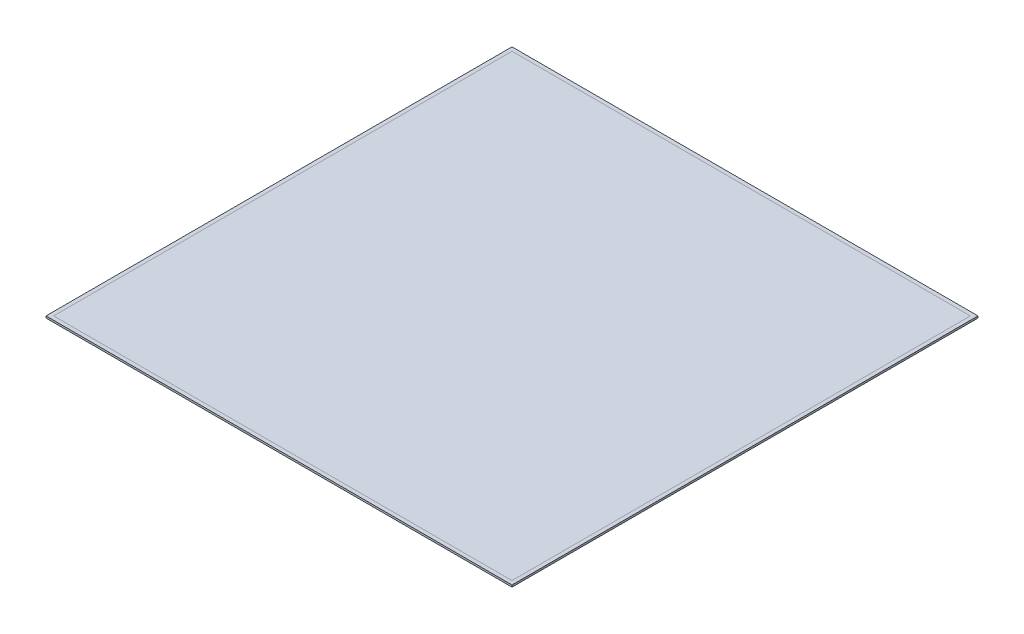
ISO-10303-21;
HEADER;
FILE_DESCRIPTION(('STEP AP214'),'2;1');
FILE_NAME('part.step','',(''),(''),'','','');
FILE_SCHEMA(('AUTOMOTIVE_DESIGN { 1 0 10303 214 1 1 1 1 }'));
ENDSEC;
DATA;
#1=APPLICATION_CONTEXT('core data for automotive mechanical design processes');
#2=APPLICATION_PROTOCOL_DEFINITION('international standard','automotive_design',2000,#1);
#3=PRODUCT_CONTEXT('',#1,'mechanical');
#4=PRODUCT('Part','Part','',(#3));
#5=PRODUCT_RELATED_PRODUCT_CATEGORY('part','',(#4));
#6=PRODUCT_DEFINITION_FORMATION('','',#4);
#7=PRODUCT_DEFINITION_CONTEXT('part definition',#1,'design');
#8=PRODUCT_DEFINITION('design','',#6,#7);
#9=PRODUCT_DEFINITION_SHAPE('','',#8);
#10=(LENGTH_UNIT() NAMED_UNIT(*) SI_UNIT(.MILLI.,.METRE.));
#11=(NAMED_UNIT(*) PLANE_ANGLE_UNIT() SI_UNIT($,.RADIAN.));
#12=(NAMED_UNIT(*) SI_UNIT($,.STERADIAN.) SOLID_ANGLE_UNIT());
#13=UNCERTAINTY_MEASURE_WITH_UNIT(LENGTH_MEASURE(1.E-05),#10,'distance_accuracy_value','');
#14=(GEOMETRIC_REPRESENTATION_CONTEXT(3) GLOBAL_UNCERTAINTY_ASSIGNED_CONTEXT((#13)) GLOBAL_UNIT_ASSIGNED_CONTEXT((#10,
#11,#12)) REPRESENTATION_CONTEXT('',''));
#15=CARTESIAN_POINT('',(0.,0.,0.));
#16=DIRECTION('',(0.,0.,1.));
#17=DIRECTION('',(1.,0.,0.));
#18=AXIS2_PLACEMENT_3D('',#15,#16,#17);
#19=CARTESIAN_POINT('',(0.,-0.1,0.));
#20=DIRECTION('',(0.,-1.,0.));
#21=DIRECTION('',(0.,0.,-1.));
#22=AXIS2_PLACEMENT_3D('',#19,#20,#21);
#23=PLANE('',#22);
#24=DIRECTION('',(0.,0.,1.));
#25=VECTOR('',#24,1.);
#26=CARTESIAN_POINT('',(420.,-0.1,420.));
#27=LINE('',#26,#25);
#28=CARTESIAN_POINT('',(420.,-0.1,-420.));
#29=VERTEX_POINT('',#28);
#30=CARTESIAN_POINT('',(420.,-0.1,420.));
#31=VERTEX_POINT('',#30);
#32=EDGE_CURVE('E144',#29,#31,#27,.T.);
#33=ORIENTED_EDGE('',*,*,#32,.T.);
#34=DIRECTION('',(-1.,0.,0.));
#35=VECTOR('',#34,1.);
#36=CARTESIAN_POINT('',(-420.,-0.1,420.));
#37=LINE('',#36,#35);
#38=CARTESIAN_POINT('',(-420.,-0.1,420.));
#39=VERTEX_POINT('',#38);
#40=EDGE_CURVE('E147',#31,#39,#37,.T.);
#41=ORIENTED_EDGE('',*,*,#40,.T.);
#42=DIRECTION('',(0.,0.,-1.));
#43=VECTOR('',#42,1.);
#44=CARTESIAN_POINT('',(-420.,-0.1,420.));
#45=LINE('',#44,#43);
#46=CARTESIAN_POINT('',(-420.,-0.1,-420.));
#47=VERTEX_POINT('',#46);
#48=EDGE_CURVE('E150',#39,#47,#45,.T.);
#49=ORIENTED_EDGE('',*,*,#48,.T.);
#50=DIRECTION('',(1.,0.,0.));
#51=VECTOR('',#50,1.);
#52=CARTESIAN_POINT('',(-420.,-0.1,-420.));
#53=LINE('',#52,#51);
#54=EDGE_CURVE('E152',#47,#29,#53,.T.);
#55=ORIENTED_EDGE('',*,*,#54,.T.);
#56=EDGE_LOOP('',(#33,#41,#49,#55));
#57=FACE_BOUND('',#56,.T.);
#58=DIRECTION('',(-1.,0.,0.));
#59=VECTOR('',#58,1.);
#60=CARTESIAN_POINT('',(-400.,-0.1,400.));
#61=LINE('',#60,#59);
#62=CARTESIAN_POINT('',(400.,-0.1,400.));
#63=VERTEX_POINT('',#62);
#64=CARTESIAN_POINT('',(-400.,-0.1,400.));
#65=VERTEX_POINT('',#64);
#66=EDGE_CURVE('E116',#63,#65,#61,.T.);
#67=ORIENTED_EDGE('',*,*,#66,.F.);
#68=DIRECTION('',(0.,0.,1.));
#69=VECTOR('',#68,1.);
#70=CARTESIAN_POINT('',(400.,-0.1,400.));
#71=LINE('',#70,#69);
#72=CARTESIAN_POINT('',(400.,-0.1,-400.));
#73=VERTEX_POINT('',#72);
#74=EDGE_CURVE('E108',#73,#63,#71,.T.);
#75=ORIENTED_EDGE('',*,*,#74,.F.);
#76=DIRECTION('',(1.,0.,0.));
#77=VECTOR('',#76,1.);
#78=CARTESIAN_POINT('',(-400.,-0.1,-400.));
#79=LINE('',#78,#77);
#80=CARTESIAN_POINT('',(-400.,-0.1,-400.));
#81=VERTEX_POINT('',#80);
#82=EDGE_CURVE('E130',#81,#73,#79,.T.);
#83=ORIENTED_EDGE('',*,*,#82,.F.);
#84=DIRECTION('',(0.,0.,-1.));
#85=VECTOR('',#84,1.);
#86=CARTESIAN_POINT('',(-400.,-0.1,400.));
#87=LINE('',#86,#85);
#88=EDGE_CURVE('E128',#65,#81,#87,.T.);
#89=ORIENTED_EDGE('',*,*,#88,.F.);
#90=EDGE_LOOP('',(#67,#75,#83,#89));
#91=FACE_BOUND('',#90,.T.);
#92=ADVANCED_FACE('F43',(#57,#91),#23,.T.);
#93=CARTESIAN_POINT('',(0.,0.,0.));
#94=DIRECTION('',(0.,-1.,0.));
#95=DIRECTION('',(0.,0.,-1.));
#96=AXIS2_PLACEMENT_3D('',#93,#94,#95);
#97=PLANE('',#96);
#98=DIRECTION('',(0.,0.,1.));
#99=VECTOR('',#98,1.);
#100=CARTESIAN_POINT('',(420.,0.,420.));
#101=LINE('',#100,#99);
#102=CARTESIAN_POINT('',(420.,0.,-420.));
#103=VERTEX_POINT('',#102);
#104=CARTESIAN_POINT('',(420.,0.,420.));
#105=VERTEX_POINT('',#104);
#106=EDGE_CURVE('E124',#103,#105,#101,.T.);
#107=ORIENTED_EDGE('',*,*,#106,.F.);
#108=DIRECTION('',(1.,0.,0.));
#109=VECTOR('',#108,1.);
#110=CARTESIAN_POINT('',(-420.,0.,-420.));
#111=LINE('',#110,#109);
#112=CARTESIAN_POINT('',(-420.,0.,-420.));
#113=VERTEX_POINT('',#112);
#114=EDGE_CURVE('E148',#113,#103,#111,.T.);
#115=ORIENTED_EDGE('',*,*,#114,.F.);
#116=DIRECTION('',(0.,0.,-1.));
#117=VECTOR('',#116,1.);
#118=CARTESIAN_POINT('',(-420.,0.,420.));
#119=LINE('',#118,#117);
#120=CARTESIAN_POINT('',(-420.,0.,420.));
#121=VERTEX_POINT('',#120);
#122=EDGE_CURVE('E159',#121,#113,#119,.T.);
#123=ORIENTED_EDGE('',*,*,#122,.F.);
#124=DIRECTION('',(-1.,0.,0.));
#125=VECTOR('',#124,1.);
#126=CARTESIAN_POINT('',(-420.,0.,420.));
#127=LINE('',#126,#125);
#128=EDGE_CURVE('E157',#105,#121,#127,.T.);
#129=ORIENTED_EDGE('',*,*,#128,.F.);
#130=EDGE_LOOP('',(#107,#115,#123,#129));
#131=FACE_BOUND('',#130,.T.);
#132=DIRECTION('',(0.,0.,1.));
#133=VECTOR('',#132,1.);
#134=CARTESIAN_POINT('',(400.,0.,400.));
#135=LINE('',#134,#133);
#136=CARTESIAN_POINT('',(400.,0.,-400.));
#137=VERTEX_POINT('',#136);
#138=CARTESIAN_POINT('',(400.,0.,400.));
#139=VERTEX_POINT('',#138);
#140=EDGE_CURVE('E66',#137,#139,#135,.T.);
#141=ORIENTED_EDGE('',*,*,#140,.T.);
#142=DIRECTION('',(-1.,0.,0.));
#143=VECTOR('',#142,1.);
#144=CARTESIAN_POINT('',(-400.,0.,400.));
#145=LINE('',#144,#143);
#146=CARTESIAN_POINT('',(-400.,0.,400.));
#147=VERTEX_POINT('',#146);
#148=EDGE_CURVE('E123',#139,#147,#145,.T.);
#149=ORIENTED_EDGE('',*,*,#148,.T.);
#150=DIRECTION('',(0.,0.,-1.));
#151=VECTOR('',#150,1.);
#152=CARTESIAN_POINT('',(-400.,0.,400.));
#153=LINE('',#152,#151);
#154=CARTESIAN_POINT('',(-400.,0.,-400.));
#155=VERTEX_POINT('',#154);
#156=EDGE_CURVE('E136',#147,#155,#153,.T.);
#157=ORIENTED_EDGE('',*,*,#156,.T.);
#158=DIRECTION('',(1.,0.,0.));
#159=VECTOR('',#158,1.);
#160=CARTESIAN_POINT('',(-400.,0.,-400.));
#161=LINE('',#160,#159);
#162=EDGE_CURVE('E117',#155,#137,#161,.T.);
#163=ORIENTED_EDGE('',*,*,#162,.T.);
#164=EDGE_LOOP('',(#141,#149,#157,#163));
#165=FACE_BOUND('',#164,.T.);
#166=ADVANCED_FACE('F177',(#131,#165),#97,.F.);
#167=CARTESIAN_POINT('',(420.,-0.1,420.));
#168=DIRECTION('',(-1.,0.,0.));
#169=DIRECTION('',(0.,0.,1.));
#170=AXIS2_PLACEMENT_3D('',#167,#168,#169);
#171=PLANE('',#170);
#172=ORIENTED_EDGE('',*,*,#106,.T.);
#173=DIRECTION('',(0.,1.,0.));
#174=VECTOR('',#173,1.);
#175=CARTESIAN_POINT('',(420.,-0.1,420.));
#176=LINE('',#175,#174);
#177=EDGE_CURVE('E12',#31,#105,#176,.T.);
#178=ORIENTED_EDGE('',*,*,#177,.F.);
#179=ORIENTED_EDGE('',*,*,#32,.F.);
#180=DIRECTION('',(0.,1.,0.));
#181=VECTOR('',#180,1.);
#182=CARTESIAN_POINT('',(420.,-0.1,-420.));
#183=LINE('',#182,#181);
#184=EDGE_CURVE('E154',#29,#103,#183,.T.);
#185=ORIENTED_EDGE('',*,*,#184,.T.);
#186=EDGE_LOOP('',(#172,#178,#179,#185));
#187=FACE_BOUND('',#186,.T.);
#188=ADVANCED_FACE('F45',(#187),#171,.F.);
#189=CARTESIAN_POINT('',(-420.,-0.1,420.));
#190=DIRECTION('',(0.,0.,-1.));
#191=DIRECTION('',(-1.,0.,0.));
#192=AXIS2_PLACEMENT_3D('',#189,#190,#191);
#193=PLANE('',#192);
#194=ORIENTED_EDGE('',*,*,#128,.T.);
#195=DIRECTION('',(0.,1.,0.));
#196=VECTOR('',#195,1.);
#197=CARTESIAN_POINT('',(-420.,-0.1,420.));
#198=LINE('',#197,#196);
#199=EDGE_CURVE('E51',#39,#121,#198,.T.);
#200=ORIENTED_EDGE('',*,*,#199,.F.);
#201=ORIENTED_EDGE('',*,*,#40,.F.);
#202=ORIENTED_EDGE('',*,*,#177,.T.);
#203=EDGE_LOOP('',(#194,#200,#201,#202));
#204=FACE_BOUND('',#203,.T.);
#205=ADVANCED_FACE('F187',(#204),#193,.F.);
#206=CARTESIAN_POINT('',(-420.,-0.1,420.));
#207=DIRECTION('',(1.,0.,0.));
#208=DIRECTION('',(0.,0.,-1.));
#209=AXIS2_PLACEMENT_3D('',#206,#207,#208);
#210=PLANE('',#209);
#211=ORIENTED_EDGE('',*,*,#122,.T.);
#212=DIRECTION('',(0.,1.,0.));
#213=VECTOR('',#212,1.);
#214=CARTESIAN_POINT('',(-420.,-0.1,-420.));
#215=LINE('',#214,#213);
#216=EDGE_CURVE('E164',#47,#113,#215,.T.);
#217=ORIENTED_EDGE('',*,*,#216,.F.);
#218=ORIENTED_EDGE('',*,*,#48,.F.);
#219=ORIENTED_EDGE('',*,*,#199,.T.);
#220=EDGE_LOOP('',(#211,#217,#218,#219));
#221=FACE_BOUND('',#220,.T.);
#222=ADVANCED_FACE('F171',(#221),#210,.F.);
#223=CARTESIAN_POINT('',(-420.,-0.1,-420.));
#224=DIRECTION('',(0.,0.,1.));
#225=DIRECTION('',(1.,0.,0.));
#226=AXIS2_PLACEMENT_3D('',#223,#224,#225);
#227=PLANE('',#226);
#228=ORIENTED_EDGE('',*,*,#114,.T.);
#229=ORIENTED_EDGE('',*,*,#184,.F.);
#230=ORIENTED_EDGE('',*,*,#54,.F.);
#231=ORIENTED_EDGE('',*,*,#216,.T.);
#232=EDGE_LOOP('',(#228,#229,#230,#231));
#233=FACE_BOUND('',#232,.T.);
#234=ADVANCED_FACE('F181',(#233),#227,.F.);
#235=CARTESIAN_POINT('',(400.,-0.1,400.));
#236=DIRECTION('',(-1.,0.,0.));
#237=DIRECTION('',(0.,0.,1.));
#238=AXIS2_PLACEMENT_3D('',#235,#236,#237);
#239=PLANE('',#238);
#240=ORIENTED_EDGE('',*,*,#140,.F.);
#241=DIRECTION('',(0.,1.,0.));
#242=VECTOR('',#241,1.);
#243=CARTESIAN_POINT('',(400.,-0.1,-400.));
#244=LINE('',#243,#242);
#245=EDGE_CURVE('E112',#73,#137,#244,.T.);
#246=ORIENTED_EDGE('',*,*,#245,.F.);
#247=ORIENTED_EDGE('',*,*,#74,.T.);
#248=DIRECTION('',(0.,1.,0.));
#249=VECTOR('',#248,1.);
#250=CARTESIAN_POINT('',(400.,-0.1,400.));
#251=LINE('',#250,#249);
#252=EDGE_CURVE('E111',#63,#139,#251,.T.);
#253=ORIENTED_EDGE('',*,*,#252,.T.);
#254=EDGE_LOOP('',(#240,#246,#247,#253));
#255=FACE_BOUND('',#254,.T.);
#256=ADVANCED_FACE('F110',(#255),#239,.T.);
#257=CARTESIAN_POINT('',(-400.,-0.1,400.));
#258=DIRECTION('',(0.,0.,-1.));
#259=DIRECTION('',(-1.,0.,0.));
#260=AXIS2_PLACEMENT_3D('',#257,#258,#259);
#261=PLANE('',#260);
#262=ORIENTED_EDGE('',*,*,#148,.F.);
#263=ORIENTED_EDGE('',*,*,#252,.F.);
#264=ORIENTED_EDGE('',*,*,#66,.T.);
#265=DIRECTION('',(0.,1.,0.));
#266=VECTOR('',#265,1.);
#267=CARTESIAN_POINT('',(-400.,-0.1,400.));
#268=LINE('',#267,#266);
#269=EDGE_CURVE('E125',#65,#147,#268,.T.);
#270=ORIENTED_EDGE('',*,*,#269,.T.);
#271=EDGE_LOOP('',(#262,#263,#264,#270));
#272=FACE_BOUND('',#271,.T.);
#273=ADVANCED_FACE('F120',(#272),#261,.T.);
#274=CARTESIAN_POINT('',(-400.,-0.1,400.));
#275=DIRECTION('',(1.,0.,0.));
#276=DIRECTION('',(0.,0.,-1.));
#277=AXIS2_PLACEMENT_3D('',#274,#275,#276);
#278=PLANE('',#277);
#279=ORIENTED_EDGE('',*,*,#156,.F.);
#280=ORIENTED_EDGE('',*,*,#269,.F.);
#281=ORIENTED_EDGE('',*,*,#88,.T.);
#282=DIRECTION('',(0.,1.,0.));
#283=VECTOR('',#282,1.);
#284=CARTESIAN_POINT('',(-400.,-0.1,-400.));
#285=LINE('',#284,#283);
#286=EDGE_CURVE('E58',#81,#155,#285,.T.);
#287=ORIENTED_EDGE('',*,*,#286,.T.);
#288=EDGE_LOOP('',(#279,#280,#281,#287));
#289=FACE_BOUND('',#288,.T.);
#290=ADVANCED_FACE('F210',(#289),#278,.T.);
#291=CARTESIAN_POINT('',(-400.,-0.1,-400.));
#292=DIRECTION('',(0.,0.,1.));
#293=DIRECTION('',(1.,0.,0.));
#294=AXIS2_PLACEMENT_3D('',#291,#292,#293);
#295=PLANE('',#294);
#296=ORIENTED_EDGE('',*,*,#162,.F.);
#297=ORIENTED_EDGE('',*,*,#286,.F.);
#298=ORIENTED_EDGE('',*,*,#82,.T.);
#299=ORIENTED_EDGE('',*,*,#245,.T.);
#300=EDGE_LOOP('',(#296,#297,#298,#299));
#301=FACE_BOUND('',#300,.T.);
#302=ADVANCED_FACE('F214',(#301),#295,.T.);
#303=CLOSED_SHELL('',(#92,#166,#188,#205,#222,#234,#256,#273,#290,#302));
#304=MANIFOLD_SOLID_BREP('B2',#303);
#305=CARTESIAN_POINT('',(400.,-0.1,400.));
#306=DIRECTION('',(-1.,0.,0.));
#307=DIRECTION('',(0.,0.,1.));
#308=AXIS2_PLACEMENT_3D('',#305,#306,#307);
#309=PLANE('',#308);
#310=DIRECTION('',(0.,0.,1.));
#311=VECTOR('',#310,1.);
#312=CARTESIAN_POINT('',(400.,0.,400.));
#313=LINE('',#312,#311);
#314=CARTESIAN_POINT('',(400.,0.,-400.));
#315=VERTEX_POINT('',#314);
#316=CARTESIAN_POINT('',(400.,0.,400.));
#317=VERTEX_POINT('',#316);
#318=EDGE_CURVE('E345',#315,#317,#313,.T.);
#319=ORIENTED_EDGE('',*,*,#318,.T.);
#320=DIRECTION('',(0.,1.,0.));
#321=VECTOR('',#320,1.);
#322=CARTESIAN_POINT('',(400.,-0.1,400.));
#323=LINE('',#322,#321);
#324=CARTESIAN_POINT('',(400.,-0.1,400.));
#325=VERTEX_POINT('',#324);
#326=EDGE_CURVE('E41',#325,#317,#323,.T.);
#327=ORIENTED_EDGE('',*,*,#326,.F.);
#328=DIRECTION('',(0.,0.,1.));
#329=VECTOR('',#328,1.);
#330=CARTESIAN_POINT('',(400.,-0.1,400.));
#331=LINE('',#330,#329);
#332=CARTESIAN_POINT('',(400.,-0.1,-400.));
#333=VERTEX_POINT('',#332);
#334=EDGE_CURVE('E333',#333,#325,#331,.T.);
#335=ORIENTED_EDGE('',*,*,#334,.F.);
#336=DIRECTION('',(0.,1.,0.));
#337=VECTOR('',#336,1.);
#338=CARTESIAN_POINT('',(400.,-0.1,-400.));
#339=LINE('',#338,#337);
#340=EDGE_CURVE('E341',#333,#315,#339,.T.);
#341=ORIENTED_EDGE('',*,*,#340,.T.);
#342=EDGE_LOOP('',(#319,#327,#335,#341));
#343=FACE_BOUND('',#342,.T.);
#344=ADVANCED_FACE('F282',(#343),#309,.F.);
#345=CARTESIAN_POINT('',(-400.,-0.1,400.));
#346=DIRECTION('',(0.,0.,-1.));
#347=DIRECTION('',(-1.,0.,0.));
#348=AXIS2_PLACEMENT_3D('',#345,#346,#347);
#349=PLANE('',#348);
#350=DIRECTION('',(-1.,0.,0.));
#351=VECTOR('',#350,1.);
#352=CARTESIAN_POINT('',(-400.,0.,400.));
#353=LINE('',#352,#351);
#354=CARTESIAN_POINT('',(-400.,0.,400.));
#355=VERTEX_POINT('',#354);
#356=EDGE_CURVE('E337',#317,#355,#353,.T.);
#357=ORIENTED_EDGE('',*,*,#356,.T.);
#358=DIRECTION('',(0.,1.,0.));
#359=VECTOR('',#358,1.);
#360=CARTESIAN_POINT('',(-400.,-0.1,400.));
#361=LINE('',#360,#359);
#362=CARTESIAN_POINT('',(-400.,-0.1,400.));
#363=VERTEX_POINT('',#362);
#364=EDGE_CURVE('E290',#363,#355,#361,.T.);
#365=ORIENTED_EDGE('',*,*,#364,.F.);
#366=DIRECTION('',(-1.,0.,0.));
#367=VECTOR('',#366,1.);
#368=CARTESIAN_POINT('',(-400.,-0.1,400.));
#369=LINE('',#368,#367);
#370=EDGE_CURVE('E328',#325,#363,#369,.T.);
#371=ORIENTED_EDGE('',*,*,#370,.F.);
#372=ORIENTED_EDGE('',*,*,#326,.T.);
#373=EDGE_LOOP('',(#357,#365,#371,#372));
#374=FACE_BOUND('',#373,.T.);
#375=ADVANCED_FACE('F336',(#374),#349,.F.);
#376=CARTESIAN_POINT('',(-400.,-0.1,400.));
#377=DIRECTION('',(1.,0.,0.));
#378=DIRECTION('',(0.,0.,-1.));
#379=AXIS2_PLACEMENT_3D('',#376,#377,#378);
#380=PLANE('',#379);
#381=DIRECTION('',(0.,0.,-1.));
#382=VECTOR('',#381,1.);
#383=CARTESIAN_POINT('',(-400.,0.,400.));
#384=LINE('',#383,#382);
#385=CARTESIAN_POINT('',(-400.,0.,-400.));
#386=VERTEX_POINT('',#385);
#387=EDGE_CURVE('E315',#355,#386,#384,.T.);
#388=ORIENTED_EDGE('',*,*,#387,.T.);
#389=DIRECTION('',(0.,1.,0.));
#390=VECTOR('',#389,1.);
#391=CARTESIAN_POINT('',(-400.,-0.1,-400.));
#392=LINE('',#391,#390);
#393=CARTESIAN_POINT('',(-400.,-0.1,-400.));
#394=VERTEX_POINT('',#393);
#395=EDGE_CURVE('E338',#394,#386,#392,.T.);
#396=ORIENTED_EDGE('',*,*,#395,.F.);
#397=DIRECTION('',(0.,0.,-1.));
#398=VECTOR('',#397,1.);
#399=CARTESIAN_POINT('',(-400.,-0.1,400.));
#400=LINE('',#399,#398);
#401=EDGE_CURVE('E331',#363,#394,#400,.T.);
#402=ORIENTED_EDGE('',*,*,#401,.F.);
#403=ORIENTED_EDGE('',*,*,#364,.T.);
#404=EDGE_LOOP('',(#388,#396,#402,#403));
#405=FACE_BOUND('',#404,.T.);
#406=ADVANCED_FACE('F339',(#405),#380,.F.);
#407=CARTESIAN_POINT('',(-400.,-0.1,-400.));
#408=DIRECTION('',(0.,0.,1.));
#409=DIRECTION('',(1.,0.,0.));
#410=AXIS2_PLACEMENT_3D('',#407,#408,#409);
#411=PLANE('',#410);
#412=DIRECTION('',(1.,0.,0.));
#413=VECTOR('',#412,1.);
#414=CARTESIAN_POINT('',(-400.,0.,-400.));
#415=LINE('',#414,#413);
#416=EDGE_CURVE('E321',#386,#315,#415,.T.);
#417=ORIENTED_EDGE('',*,*,#416,.T.);
#418=ORIENTED_EDGE('',*,*,#340,.F.);
#419=DIRECTION('',(1.,0.,0.));
#420=VECTOR('',#419,1.);
#421=CARTESIAN_POINT('',(-400.,-0.1,-400.));
#422=LINE('',#421,#420);
#423=EDGE_CURVE('E298',#394,#333,#422,.T.);
#424=ORIENTED_EDGE('',*,*,#423,.F.);
#425=ORIENTED_EDGE('',*,*,#395,.T.);
#426=EDGE_LOOP('',(#417,#418,#424,#425));
#427=FACE_BOUND('',#426,.T.);
#428=ADVANCED_FACE('F352',(#427),#411,.F.);
#429=CARTESIAN_POINT('',(0.,-0.1,0.));
#430=DIRECTION('',(0.,-1.,0.));
#431=DIRECTION('',(0.,0.,-1.));
#432=AXIS2_PLACEMENT_3D('',#429,#430,#431);
#433=PLANE('',#432);
#434=ORIENTED_EDGE('',*,*,#334,.T.);
#435=ORIENTED_EDGE('',*,*,#370,.T.);
#436=ORIENTED_EDGE('',*,*,#401,.T.);
#437=ORIENTED_EDGE('',*,*,#423,.T.);
#438=EDGE_LOOP('',(#434,#435,#436,#437));
#439=FACE_BOUND('',#438,.T.);
#440=ADVANCED_FACE('F329',(#439),#433,.T.);
#441=CARTESIAN_POINT('',(0.,0.,0.));
#442=DIRECTION('',(0.,-1.,0.));
#443=DIRECTION('',(0.,0.,-1.));
#444=AXIS2_PLACEMENT_3D('',#441,#442,#443);
#445=PLANE('',#444);
#446=ORIENTED_EDGE('',*,*,#318,.F.);
#447=ORIENTED_EDGE('',*,*,#416,.F.);
#448=ORIENTED_EDGE('',*,*,#387,.F.);
#449=ORIENTED_EDGE('',*,*,#356,.F.);
#450=EDGE_LOOP('',(#446,#447,#448,#449));
#451=FACE_BOUND('',#450,.T.);
#452=ADVANCED_FACE('F355',(#451),#445,.F.);
#453=CLOSED_SHELL('',(#344,#375,#406,#428,#440,#452));
#454=MANIFOLD_SOLID_BREP('B6',#453);
#455=CARTESIAN_POINT('',(1200.,-0.1,-1200.));
#456=DIRECTION('',(-1.,0.,0.));
#457=DIRECTION('',(0.,0.,1.));
#458=AXIS2_PLACEMENT_3D('',#455,#456,#457);
#459=PLANE('',#458);
#460=DIRECTION('',(0.,0.,1.));
#461=VECTOR('',#460,1.);
#462=CARTESIAN_POINT('',(1200.,0.,-1200.));
#463=LINE('',#462,#461);
#464=CARTESIAN_POINT('',(1200.,0.,-1200.));
#465=VERTEX_POINT('',#464);
#466=CARTESIAN_POINT('',(1200.,0.,-900.000000000001));
#467=VERTEX_POINT('',#466);
#468=EDGE_CURVE('E478',#465,#467,#463,.T.);
#469=ORIENTED_EDGE('',*,*,#468,.T.);
#470=DIRECTION('',(0.,1.,0.));
#471=VECTOR('',#470,1.);
#472=CARTESIAN_POINT('',(1200.,-0.1,-900.000000000001));
#473=LINE('',#472,#471);
#474=CARTESIAN_POINT('',(1200.,-0.1,-900.000000000001));
#475=VERTEX_POINT('',#474);
#476=EDGE_CURVE('E280',#475,#467,#473,.T.);
#477=ORIENTED_EDGE('',*,*,#476,.F.);
#478=DIRECTION('',(0.,0.,1.));
#479=VECTOR('',#478,1.);
#480=CARTESIAN_POINT('',(1200.,-0.1,-1200.));
#481=LINE('',#480,#479);
#482=CARTESIAN_POINT('',(1200.,-0.1,-1200.));
#483=VERTEX_POINT('',#482);
#484=EDGE_CURVE('E466',#483,#475,#481,.T.);
#485=ORIENTED_EDGE('',*,*,#484,.F.);
#486=DIRECTION('',(0.,1.,0.));
#487=VECTOR('',#486,1.);
#488=CARTESIAN_POINT('',(1200.,-0.1,-1200.));
#489=LINE('',#488,#487);
#490=EDGE_CURVE('E474',#483,#465,#489,.T.);
#491=ORIENTED_EDGE('',*,*,#490,.T.);
#492=EDGE_LOOP('',(#469,#477,#485,#491));
#493=FACE_BOUND('',#492,.T.);
#494=ADVANCED_FACE('F415',(#493),#459,.F.);
#495=CARTESIAN_POINT('',(1200.,-0.1,-900.000000000001));
#496=DIRECTION('',(0.,0.,-1.));
#497=DIRECTION('',(-1.,0.,0.));
#498=AXIS2_PLACEMENT_3D('',#495,#496,#497);
#499=PLANE('',#498);
#500=DIRECTION('',(-1.,0.,0.));
#501=VECTOR('',#500,1.);
#502=CARTESIAN_POINT('',(1200.,0.,-900.000000000001));
#503=LINE('',#502,#501);
#504=CARTESIAN_POINT('',(899.999999999999,0.,-900.000000000001));
#505=VERTEX_POINT('',#504);
#506=EDGE_CURVE('E470',#467,#505,#503,.T.);
#507=ORIENTED_EDGE('',*,*,#506,.T.);
#508=DIRECTION('',(0.,1.,0.));
#509=VECTOR('',#508,1.);
#510=CARTESIAN_POINT('',(899.999999999999,-0.1,-900.000000000001));
#511=LINE('',#510,#509);
#512=CARTESIAN_POINT('',(899.999999999999,-0.1,-900.000000000001));
#513=VERTEX_POINT('',#512);
#514=EDGE_CURVE('E423',#513,#505,#511,.T.);
#515=ORIENTED_EDGE('',*,*,#514,.F.);
#516=DIRECTION('',(-1.,0.,0.));
#517=VECTOR('',#516,1.);
#518=CARTESIAN_POINT('',(1200.,-0.1,-900.000000000001));
#519=LINE('',#518,#517);
#520=EDGE_CURVE('E461',#475,#513,#519,.T.);
#521=ORIENTED_EDGE('',*,*,#520,.F.);
#522=ORIENTED_EDGE('',*,*,#476,.T.);
#523=EDGE_LOOP('',(#507,#515,#521,#522));
#524=FACE_BOUND('',#523,.T.);
#525=ADVANCED_FACE('F469',(#524),#499,.F.);
#526=CARTESIAN_POINT('',(899.999999999999,-0.1,-1200.));
#527=DIRECTION('',(1.,0.,0.));
#528=DIRECTION('',(0.,0.,-1.));
#529=AXIS2_PLACEMENT_3D('',#526,#527,#528);
#530=PLANE('',#529);
#531=DIRECTION('',(0.,0.,-1.));
#532=VECTOR('',#531,1.);
#533=CARTESIAN_POINT('',(899.999999999999,0.,-1200.));
#534=LINE('',#533,#532);
#535=CARTESIAN_POINT('',(899.999999999999,0.,-1200.));
#536=VERTEX_POINT('',#535);
#537=EDGE_CURVE('E448',#505,#536,#534,.T.);
#538=ORIENTED_EDGE('',*,*,#537,.T.);
#539=DIRECTION('',(0.,1.,0.));
#540=VECTOR('',#539,1.);
#541=CARTESIAN_POINT('',(899.999999999999,-0.1,-1200.));
#542=LINE('',#541,#540);
#543=CARTESIAN_POINT('',(899.999999999999,-0.1,-1200.));
#544=VERTEX_POINT('',#543);
#545=EDGE_CURVE('E471',#544,#536,#542,.T.);
#546=ORIENTED_EDGE('',*,*,#545,.F.);
#547=DIRECTION('',(0.,0.,-1.));
#548=VECTOR('',#547,1.);
#549=CARTESIAN_POINT('',(899.999999999999,-0.1,-1200.));
#550=LINE('',#549,#548);
#551=EDGE_CURVE('E464',#513,#544,#550,.T.);
#552=ORIENTED_EDGE('',*,*,#551,.F.);
#553=ORIENTED_EDGE('',*,*,#514,.T.);
#554=EDGE_LOOP('',(#538,#546,#552,#553));
#555=FACE_BOUND('',#554,.T.);
#556=ADVANCED_FACE('F472',(#555),#530,.F.);
#557=CARTESIAN_POINT('',(1200.,-0.1,-1200.));
#558=DIRECTION('',(0.,0.,1.));
#559=DIRECTION('',(1.,0.,0.));
#560=AXIS2_PLACEMENT_3D('',#557,#558,#559);
#561=PLANE('',#560);
#562=DIRECTION('',(1.,0.,0.));
#563=VECTOR('',#562,1.);
#564=CARTESIAN_POINT('',(1200.,0.,-1200.));
#565=LINE('',#564,#563);
#566=EDGE_CURVE('E454',#536,#465,#565,.T.);
#567=ORIENTED_EDGE('',*,*,#566,.T.);
#568=ORIENTED_EDGE('',*,*,#490,.F.);
#569=DIRECTION('',(1.,0.,0.));
#570=VECTOR('',#569,1.);
#571=CARTESIAN_POINT('',(1200.,-0.1,-1200.));
#572=LINE('',#571,#570);
#573=EDGE_CURVE('E431',#544,#483,#572,.T.);
#574=ORIENTED_EDGE('',*,*,#573,.F.);
#575=ORIENTED_EDGE('',*,*,#545,.T.);
#576=EDGE_LOOP('',(#567,#568,#574,#575));
#577=FACE_BOUND('',#576,.T.);
#578=ADVANCED_FACE('F485',(#577),#561,.F.);
#579=CARTESIAN_POINT('',(0.,-0.1,0.));
#580=DIRECTION('',(0.,-1.,0.));
#581=DIRECTION('',(0.,0.,-1.));
#582=AXIS2_PLACEMENT_3D('',#579,#580,#581);
#583=PLANE('',#582);
#584=ORIENTED_EDGE('',*,*,#484,.T.);
#585=ORIENTED_EDGE('',*,*,#520,.T.);
#586=ORIENTED_EDGE('',*,*,#551,.T.);
#587=ORIENTED_EDGE('',*,*,#573,.T.);
#588=EDGE_LOOP('',(#584,#585,#586,#587));
#589=FACE_BOUND('',#588,.T.);
#590=ADVANCED_FACE('F462',(#589),#583,.T.);
#591=CARTESIAN_POINT('',(0.,0.,0.));
#592=DIRECTION('',(0.,-1.,0.));
#593=DIRECTION('',(0.,0.,-1.));
#594=AXIS2_PLACEMENT_3D('',#591,#592,#593);
#595=PLANE('',#594);
#596=ORIENTED_EDGE('',*,*,#468,.F.);
#597=ORIENTED_EDGE('',*,*,#566,.F.);
#598=ORIENTED_EDGE('',*,*,#537,.F.);
#599=ORIENTED_EDGE('',*,*,#506,.F.);
#600=EDGE_LOOP('',(#596,#597,#598,#599));
#601=FACE_BOUND('',#600,.T.);
#602=ADVANCED_FACE('F488',(#601),#595,.F.);
#603=CLOSED_SHELL('',(#494,#525,#556,#578,#590,#602));
#604=MANIFOLD_SOLID_BREP('B35',#603);
#605=CARTESIAN_POINT('',(1200.,-0.1,1200.));
#606=DIRECTION('',(-1.,0.,0.));
#607=DIRECTION('',(0.,0.,1.));
#608=AXIS2_PLACEMENT_3D('',#605,#606,#607);
#609=PLANE('',#608);
#610=DIRECTION('',(0.,0.,1.));
#611=VECTOR('',#610,1.);
#612=CARTESIAN_POINT('',(1200.,0.,1200.));
#613=LINE('',#612,#611);
#614=CARTESIAN_POINT('',(1200.,0.,899.999999999999));
#615=VERTEX_POINT('',#614);
#616=CARTESIAN_POINT('',(1200.,0.,1200.));
#617=VERTEX_POINT('',#616);
#618=EDGE_CURVE('E611',#615,#617,#613,.T.);
#619=ORIENTED_EDGE('',*,*,#618,.T.);
#620=DIRECTION('',(0.,1.,0.));
#621=VECTOR('',#620,1.);
#622=CARTESIAN_POINT('',(1200.,-0.1,1200.));
#623=LINE('',#622,#621);
#624=CARTESIAN_POINT('',(1200.,-0.1,1200.));
#625=VERTEX_POINT('',#624);
#626=EDGE_CURVE('E413',#625,#617,#623,.T.);
#627=ORIENTED_EDGE('',*,*,#626,.F.);
#628=DIRECTION('',(0.,0.,1.));
#629=VECTOR('',#628,1.);
#630=CARTESIAN_POINT('',(1200.,-0.1,1200.));
#631=LINE('',#630,#629);
#632=CARTESIAN_POINT('',(1200.,-0.1,899.999999999999));
#633=VERTEX_POINT('',#632);
#634=EDGE_CURVE('E599',#633,#625,#631,.T.);
#635=ORIENTED_EDGE('',*,*,#634,.F.);
#636=DIRECTION('',(0.,1.,0.));
#637=VECTOR('',#636,1.);
#638=CARTESIAN_POINT('',(1200.,-0.1,899.999999999999));
#639=LINE('',#638,#637);
#640=EDGE_CURVE('E607',#633,#615,#639,.T.);
#641=ORIENTED_EDGE('',*,*,#640,.T.);
#642=EDGE_LOOP('',(#619,#627,#635,#641));
#643=FACE_BOUND('',#642,.T.);
#644=ADVANCED_FACE('F548',(#643),#609,.F.);
#645=CARTESIAN_POINT('',(1200.,-0.1,1200.));
#646=DIRECTION('',(0.,0.,-1.));
#647=DIRECTION('',(-1.,0.,0.));
#648=AXIS2_PLACEMENT_3D('',#645,#646,#647);
#649=PLANE('',#648);
#650=DIRECTION('',(-1.,0.,0.));
#651=VECTOR('',#650,1.);
#652=CARTESIAN_POINT('',(1200.,0.,1200.));
#653=LINE('',#652,#651);
#654=CARTESIAN_POINT('',(900.,0.,1200.));
#655=VERTEX_POINT('',#654);
#656=EDGE_CURVE('E603',#617,#655,#653,.T.);
#657=ORIENTED_EDGE('',*,*,#656,.T.);
#658=DIRECTION('',(0.,1.,0.));
#659=VECTOR('',#658,1.);
#660=CARTESIAN_POINT('',(900.,-0.1,1200.));
#661=LINE('',#660,#659);
#662=CARTESIAN_POINT('',(900.,-0.1,1200.));
#663=VERTEX_POINT('',#662);
#664=EDGE_CURVE('E556',#663,#655,#661,.T.);
#665=ORIENTED_EDGE('',*,*,#664,.F.);
#666=DIRECTION('',(-1.,0.,0.));
#667=VECTOR('',#666,1.);
#668=CARTESIAN_POINT('',(1200.,-0.1,1200.));
#669=LINE('',#668,#667);
#670=EDGE_CURVE('E594',#625,#663,#669,.T.);
#671=ORIENTED_EDGE('',*,*,#670,.F.);
#672=ORIENTED_EDGE('',*,*,#626,.T.);
#673=EDGE_LOOP('',(#657,#665,#671,#672));
#674=FACE_BOUND('',#673,.T.);
#675=ADVANCED_FACE('F602',(#674),#649,.F.);
#676=CARTESIAN_POINT('',(900.,-0.1,1200.));
#677=DIRECTION('',(1.,0.,0.));
#678=DIRECTION('',(0.,0.,-1.));
#679=AXIS2_PLACEMENT_3D('',#676,#677,#678);
#680=PLANE('',#679);
#681=DIRECTION('',(0.,0.,-1.));
#682=VECTOR('',#681,1.);
#683=CARTESIAN_POINT('',(900.,0.,1200.));
#684=LINE('',#683,#682);
#685=CARTESIAN_POINT('',(900.,0.,899.999999999999));
#686=VERTEX_POINT('',#685);
#687=EDGE_CURVE('E581',#655,#686,#684,.T.);
#688=ORIENTED_EDGE('',*,*,#687,.T.);
#689=DIRECTION('',(0.,1.,0.));
#690=VECTOR('',#689,1.);
#691=CARTESIAN_POINT('',(900.,-0.1,899.999999999999));
#692=LINE('',#691,#690);
#693=CARTESIAN_POINT('',(900.,-0.1,899.999999999999));
#694=VERTEX_POINT('',#693);
#695=EDGE_CURVE('E604',#694,#686,#692,.T.);
#696=ORIENTED_EDGE('',*,*,#695,.F.);
#697=DIRECTION('',(0.,0.,-1.));
#698=VECTOR('',#697,1.);
#699=CARTESIAN_POINT('',(900.,-0.1,1200.));
#700=LINE('',#699,#698);
#701=EDGE_CURVE('E597',#663,#694,#700,.T.);
#702=ORIENTED_EDGE('',*,*,#701,.F.);
#703=ORIENTED_EDGE('',*,*,#664,.T.);
#704=EDGE_LOOP('',(#688,#696,#702,#703));
#705=FACE_BOUND('',#704,.T.);
#706=ADVANCED_FACE('F605',(#705),#680,.F.);
#707=CARTESIAN_POINT('',(1200.,-0.1,899.999999999999));
#708=DIRECTION('',(0.,0.,1.));
#709=DIRECTION('',(1.,0.,0.));
#710=AXIS2_PLACEMENT_3D('',#707,#708,#709);
#711=PLANE('',#710);
#712=DIRECTION('',(1.,0.,0.));
#713=VECTOR('',#712,1.);
#714=CARTESIAN_POINT('',(1200.,0.,899.999999999999));
#715=LINE('',#714,#713);
#716=EDGE_CURVE('E587',#686,#615,#715,.T.);
#717=ORIENTED_EDGE('',*,*,#716,.T.);
#718=ORIENTED_EDGE('',*,*,#640,.F.);
#719=DIRECTION('',(1.,0.,0.));
#720=VECTOR('',#719,1.);
#721=CARTESIAN_POINT('',(1200.,-0.1,899.999999999999));
#722=LINE('',#721,#720);
#723=EDGE_CURVE('E564',#694,#633,#722,.T.);
#724=ORIENTED_EDGE('',*,*,#723,.F.);
#725=ORIENTED_EDGE('',*,*,#695,.T.);
#726=EDGE_LOOP('',(#717,#718,#724,#725));
#727=FACE_BOUND('',#726,.T.);
#728=ADVANCED_FACE('F618',(#727),#711,.F.);
#729=CARTESIAN_POINT('',(0.,-0.1,0.));
#730=DIRECTION('',(0.,1.,0.));
#731=DIRECTION('',(0.,0.,1.));
#732=AXIS2_PLACEMENT_3D('',#729,#730,#731);
#733=PLANE('',#732);
#734=ORIENTED_EDGE('',*,*,#634,.T.);
#735=ORIENTED_EDGE('',*,*,#670,.T.);
#736=ORIENTED_EDGE('',*,*,#701,.T.);
#737=ORIENTED_EDGE('',*,*,#723,.T.);
#738=EDGE_LOOP('',(#734,#735,#736,#737));
#739=FACE_BOUND('',#738,.T.);
#740=ADVANCED_FACE('F595',(#739),#733,.F.);
#741=CARTESIAN_POINT('',(0.,0.,0.));
#742=DIRECTION('',(0.,1.,0.));
#743=DIRECTION('',(0.,0.,1.));
#744=AXIS2_PLACEMENT_3D('',#741,#742,#743);
#745=PLANE('',#744);
#746=ORIENTED_EDGE('',*,*,#618,.F.);
#747=ORIENTED_EDGE('',*,*,#716,.F.);
#748=ORIENTED_EDGE('',*,*,#687,.F.);
#749=ORIENTED_EDGE('',*,*,#656,.F.);
#750=EDGE_LOOP('',(#746,#747,#748,#749));
#751=FACE_BOUND('',#750,.T.);
#752=ADVANCED_FACE('F621',(#751),#745,.T.);
#753=CLOSED_SHELL('',(#644,#675,#706,#728,#740,#752));
#754=MANIFOLD_SOLID_BREP('B274',#753);
#755=CARTESIAN_POINT('',(-1200.,0.,-1200.));
#756=DIRECTION('',(-1.,0.,0.));
#757=DIRECTION('',(0.,0.,1.));
#758=AXIS2_PLACEMENT_3D('',#755,#756,#757);
#759=PLANE('',#758);
#760=DIRECTION('',(0.,0.,1.));
#761=VECTOR('',#760,1.);
#762=CARTESIAN_POINT('',(-1200.,10.,-1200.));
#763=LINE('',#762,#761);
#764=CARTESIAN_POINT('',(-1200.,10.,-1200.));
#765=VERTEX_POINT('',#764);
#766=CARTESIAN_POINT('',(-1200.,10.,1200.));
#767=VERTEX_POINT('',#766);
#768=EDGE_CURVE('E744',#765,#767,#763,.T.);
#769=ORIENTED_EDGE('',*,*,#768,.F.);
#770=DIRECTION('',(0.,1.,0.));
#771=VECTOR('',#770,1.);
#772=CARTESIAN_POINT('',(-1200.,0.,-1200.));
#773=LINE('',#772,#771);
#774=CARTESIAN_POINT('',(-1200.,0.,-1200.));
#775=VERTEX_POINT('',#774);
#776=EDGE_CURVE('E546',#775,#765,#773,.T.);
#777=ORIENTED_EDGE('',*,*,#776,.F.);
#778=DIRECTION('',(0.,0.,1.));
#779=VECTOR('',#778,1.);
#780=CARTESIAN_POINT('',(-1200.,0.,-1200.));
#781=LINE('',#780,#779);
#782=CARTESIAN_POINT('',(-1200.,0.,1200.));
#783=VERTEX_POINT('',#782);
#784=EDGE_CURVE('E738',#775,#783,#781,.T.);
#785=ORIENTED_EDGE('',*,*,#784,.T.);
#786=DIRECTION('',(0.,1.,0.));
#787=VECTOR('',#786,1.);
#788=CARTESIAN_POINT('',(-1200.,0.,1200.));
#789=LINE('',#788,#787);
#790=EDGE_CURVE('E683',#783,#767,#789,.T.);
#791=ORIENTED_EDGE('',*,*,#790,.T.);
#792=EDGE_LOOP('',(#769,#777,#785,#791));
#793=FACE_BOUND('',#792,.T.);
#794=ADVANCED_FACE('F680',(#793),#759,.T.);
#795=CARTESIAN_POINT('',(1200.,0.,-1200.));
#796=DIRECTION('',(0.,0.,-1.));
#797=DIRECTION('',(-1.,0.,0.));
#798=AXIS2_PLACEMENT_3D('',#795,#796,#797);
#799=PLANE('',#798);
#800=DIRECTION('',(-1.,0.,0.));
#801=VECTOR('',#800,1.);
#802=CARTESIAN_POINT('',(1200.,10.,-1200.));
#803=LINE('',#802,#801);
#804=CARTESIAN_POINT('',(1200.,10.,-1200.));
#805=VERTEX_POINT('',#804);
#806=EDGE_CURVE('E740',#805,#765,#803,.T.);
#807=ORIENTED_EDGE('',*,*,#806,.F.);
#808=DIRECTION('',(0.,1.,0.));
#809=VECTOR('',#808,1.);
#810=CARTESIAN_POINT('',(1200.,0.,-1200.));
#811=LINE('',#810,#809);
#812=CARTESIAN_POINT('',(1200.,0.,-1200.));
#813=VERTEX_POINT('',#812);
#814=EDGE_CURVE('E689',#813,#805,#811,.T.);
#815=ORIENTED_EDGE('',*,*,#814,.F.);
#816=DIRECTION('',(-1.,0.,0.));
#817=VECTOR('',#816,1.);
#818=CARTESIAN_POINT('',(1200.,0.,-1200.));
#819=LINE('',#818,#817);
#820=EDGE_CURVE('E735',#813,#775,#819,.T.);
#821=ORIENTED_EDGE('',*,*,#820,.T.);
#822=ORIENTED_EDGE('',*,*,#776,.T.);
#823=EDGE_LOOP('',(#807,#815,#821,#822));
#824=FACE_BOUND('',#823,.T.);
#825=ADVANCED_FACE('F754',(#824),#799,.T.);
#826=CARTESIAN_POINT('',(1200.,0.,-1200.));
#827=DIRECTION('',(1.,0.,0.));
#828=DIRECTION('',(0.,0.,-1.));
#829=AXIS2_PLACEMENT_3D('',#826,#827,#828);
#830=PLANE('',#829);
#831=DIRECTION('',(0.,0.,-1.));
#832=VECTOR('',#831,1.);
#833=CARTESIAN_POINT('',(1200.,10.,-1200.));
#834=LINE('',#833,#832);
#835=CARTESIAN_POINT('',(1200.,10.,1200.));
#836=VERTEX_POINT('',#835);
#837=EDGE_CURVE('E730',#836,#805,#834,.T.);
#838=ORIENTED_EDGE('',*,*,#837,.F.);
#839=DIRECTION('',(0.,1.,0.));
#840=VECTOR('',#839,1.);
#841=CARTESIAN_POINT('',(1200.,0.,1200.));
#842=LINE('',#841,#840);
#843=CARTESIAN_POINT('',(1200.,0.,1200.));
#844=VERTEX_POINT('',#843);
#845=EDGE_CURVE('E725',#844,#836,#842,.T.);
#846=ORIENTED_EDGE('',*,*,#845,.F.);
#847=DIRECTION('',(0.,0.,-1.));
#848=VECTOR('',#847,1.);
#849=CARTESIAN_POINT('',(1200.,0.,-1200.));
#850=LINE('',#849,#848);
#851=EDGE_CURVE('E728',#844,#813,#850,.T.);
#852=ORIENTED_EDGE('',*,*,#851,.T.);
#853=ORIENTED_EDGE('',*,*,#814,.T.);
#854=EDGE_LOOP('',(#838,#846,#852,#853));
#855=FACE_BOUND('',#854,.T.);
#856=ADVANCED_FACE('F727',(#855),#830,.T.);
#857=CARTESIAN_POINT('',(1200.,0.,1200.));
#858=DIRECTION('',(0.,0.,1.));
#859=DIRECTION('',(1.,0.,0.));
#860=AXIS2_PLACEMENT_3D('',#857,#858,#859);
#861=PLANE('',#860);
#862=DIRECTION('',(1.,0.,0.));
#863=VECTOR('',#862,1.);
#864=CARTESIAN_POINT('',(1200.,10.,1200.));
#865=LINE('',#864,#863);
#866=EDGE_CURVE('E747',#767,#836,#865,.T.);
#867=ORIENTED_EDGE('',*,*,#866,.F.);
#868=ORIENTED_EDGE('',*,*,#790,.F.);
#869=DIRECTION('',(1.,0.,0.));
#870=VECTOR('',#869,1.);
#871=CARTESIAN_POINT('',(1200.,0.,1200.));
#872=LINE('',#871,#870);
#873=EDGE_CURVE('E734',#783,#844,#872,.T.);
#874=ORIENTED_EDGE('',*,*,#873,.T.);
#875=ORIENTED_EDGE('',*,*,#845,.T.);
#876=EDGE_LOOP('',(#867,#868,#874,#875));
#877=FACE_BOUND('',#876,.T.);
#878=ADVANCED_FACE('F737',(#877),#861,.T.);
#879=CARTESIAN_POINT('',(0.,0.,0.));
#880=DIRECTION('',(0.,-1.,0.));
#881=DIRECTION('',(0.,0.,-1.));
#882=AXIS2_PLACEMENT_3D('',#879,#880,#881);
#883=PLANE('',#882);
#884=ORIENTED_EDGE('',*,*,#784,.F.);
#885=ORIENTED_EDGE('',*,*,#820,.F.);
#886=ORIENTED_EDGE('',*,*,#851,.F.);
#887=ORIENTED_EDGE('',*,*,#873,.F.);
#888=EDGE_LOOP('',(#884,#885,#886,#887));
#889=FACE_BOUND('',#888,.T.);
#890=ADVANCED_FACE('F733',(#889),#883,.T.);
#891=CARTESIAN_POINT('',(0.,10.,0.));
#892=DIRECTION('',(0.,-1.,0.));
#893=DIRECTION('',(0.,0.,-1.));
#894=AXIS2_PLACEMENT_3D('',#891,#892,#893);
#895=PLANE('',#894);
#896=ORIENTED_EDGE('',*,*,#768,.T.);
#897=ORIENTED_EDGE('',*,*,#866,.T.);
#898=ORIENTED_EDGE('',*,*,#837,.T.);
#899=ORIENTED_EDGE('',*,*,#806,.T.);
#900=EDGE_LOOP('',(#896,#897,#898,#899));
#901=FACE_BOUND('',#900,.T.);
#902=ADVANCED_FACE('F753',(#901),#895,.F.);
#903=CLOSED_SHELL('',(#794,#825,#856,#878,#890,#902));
#904=MANIFOLD_SOLID_BREP('B407',#903);
#905=CARTESIAN_POINT('',(0.,10.,0.));
#906=DIRECTION('',(0.,1.,0.));
#907=DIRECTION('',(0.,0.,1.));
#908=AXIS2_PLACEMENT_3D('',#905,#906,#907);
#909=PLANE('',#908);
#910=DIRECTION('',(0.,0.,-1.));
#911=VECTOR('',#910,1.);
#912=CARTESIAN_POINT('',(1220.,10.,-1220.));
#913=LINE('',#912,#911);
#914=CARTESIAN_POINT('',(1220.,10.,1220.));
#915=VERTEX_POINT('',#914);
#916=CARTESIAN_POINT('',(1220.,10.,-1220.));
#917=VERTEX_POINT('',#916);
#918=EDGE_CURVE('E904',#915,#917,#913,.T.);
#919=ORIENTED_EDGE('',*,*,#918,.T.);
#920=DIRECTION('',(-1.,0.,0.));
#921=VECTOR('',#920,1.);
#922=CARTESIAN_POINT('',(-1220.,10.,-1220.));
#923=LINE('',#922,#921);
#924=CARTESIAN_POINT('',(-1220.,10.,-1220.));
#925=VERTEX_POINT('',#924);
#926=EDGE_CURVE('E907',#917,#925,#923,.T.);
#927=ORIENTED_EDGE('',*,*,#926,.T.);
#928=DIRECTION('',(0.,0.,1.));
#929=VECTOR('',#928,1.);
#930=CARTESIAN_POINT('',(-1220.,10.,-1220.));
#931=LINE('',#930,#929);
#932=CARTESIAN_POINT('',(-1220.,10.,1220.));
#933=VERTEX_POINT('',#932);
#934=EDGE_CURVE('E910',#925,#933,#931,.T.);
#935=ORIENTED_EDGE('',*,*,#934,.T.);
#936=DIRECTION('',(1.,0.,0.));
#937=VECTOR('',#936,1.);
#938=CARTESIAN_POINT('',(-1220.,10.,1220.));
#939=LINE('',#938,#937);
#940=EDGE_CURVE('E912',#933,#915,#939,.T.);
#941=ORIENTED_EDGE('',*,*,#940,.T.);
#942=EDGE_LOOP('',(#919,#927,#935,#941));
#943=FACE_BOUND('',#942,.T.);
#944=DIRECTION('',(-1.,0.,0.));
#945=VECTOR('',#944,1.);
#946=CARTESIAN_POINT('',(-1200.,10.,-1200.));
#947=LINE('',#946,#945);
#948=CARTESIAN_POINT('',(1200.,10.,-1200.));
#949=VERTEX_POINT('',#948);
#950=CARTESIAN_POINT('',(-1200.,10.,-1200.));
#951=VERTEX_POINT('',#950);
#952=EDGE_CURVE('E876',#949,#951,#947,.T.);
#953=ORIENTED_EDGE('',*,*,#952,.F.);
#954=DIRECTION('',(0.,0.,-1.));
#955=VECTOR('',#954,1.);
#956=CARTESIAN_POINT('',(1200.,10.,-1200.));
#957=LINE('',#956,#955);
#958=CARTESIAN_POINT('',(1200.,10.,1200.));
#959=VERTEX_POINT('',#958);
#960=EDGE_CURVE('E868',#959,#949,#957,.T.);
#961=ORIENTED_EDGE('',*,*,#960,.F.);
#962=DIRECTION('',(1.,0.,0.));
#963=VECTOR('',#962,1.);
#964=CARTESIAN_POINT('',(-1200.,10.,1200.));
#965=LINE('',#964,#963);
#966=CARTESIAN_POINT('',(-1200.,10.,1200.));
#967=VERTEX_POINT('',#966);
#968=EDGE_CURVE('E890',#967,#959,#965,.T.);
#969=ORIENTED_EDGE('',*,*,#968,.F.);
#970=DIRECTION('',(0.,0.,1.));
#971=VECTOR('',#970,1.);
#972=CARTESIAN_POINT('',(-1200.,10.,-1200.));
#973=LINE('',#972,#971);
#974=EDGE_CURVE('E888',#951,#967,#973,.T.);
#975=ORIENTED_EDGE('',*,*,#974,.F.);
#976=EDGE_LOOP('',(#953,#961,#969,#975));
#977=FACE_BOUND('',#976,.T.);
#978=ADVANCED_FACE('F803',(#943,#977),#909,.T.);
#979=CARTESIAN_POINT('',(0.,0.,0.));
#980=DIRECTION('',(0.,1.,0.));
#981=DIRECTION('',(0.,0.,1.));
#982=AXIS2_PLACEMENT_3D('',#979,#980,#981);
#983=PLANE('',#982);
#984=DIRECTION('',(0.,0.,-1.));
#985=VECTOR('',#984,1.);
#986=CARTESIAN_POINT('',(1220.,0.,-1220.));
#987=LINE('',#986,#985);
#988=CARTESIAN_POINT('',(1220.,0.,1220.));
#989=VERTEX_POINT('',#988);
#990=CARTESIAN_POINT('',(1220.,0.,-1220.));
#991=VERTEX_POINT('',#990);
#992=EDGE_CURVE('E884',#989,#991,#987,.T.);
#993=ORIENTED_EDGE('',*,*,#992,.F.);
#994=DIRECTION('',(1.,0.,0.));
#995=VECTOR('',#994,1.);
#996=CARTESIAN_POINT('',(-1220.,0.,1220.));
#997=LINE('',#996,#995);
#998=CARTESIAN_POINT('',(-1220.,0.,1220.));
#999=VERTEX_POINT('',#998);
#1000=EDGE_CURVE('E908',#999,#989,#997,.T.);
#1001=ORIENTED_EDGE('',*,*,#1000,.F.);
#1002=DIRECTION('',(0.,0.,1.));
#1003=VECTOR('',#1002,1.);
#1004=CARTESIAN_POINT('',(-1220.,0.,-1220.));
#1005=LINE('',#1004,#1003);
#1006=CARTESIAN_POINT('',(-1220.,0.,-1220.));
#1007=VERTEX_POINT('',#1006);
#1008=EDGE_CURVE('E919',#1007,#999,#1005,.T.);
#1009=ORIENTED_EDGE('',*,*,#1008,.F.);
#1010=DIRECTION('',(-1.,0.,0.));
#1011=VECTOR('',#1010,1.);
#1012=CARTESIAN_POINT('',(-1220.,0.,-1220.));
#1013=LINE('',#1012,#1011);
#1014=EDGE_CURVE('E917',#991,#1007,#1013,.T.);
#1015=ORIENTED_EDGE('',*,*,#1014,.F.);
#1016=EDGE_LOOP('',(#993,#1001,#1009,#1015));
#1017=FACE_BOUND('',#1016,.T.);
#1018=DIRECTION('',(0.,0.,-1.));
#1019=VECTOR('',#1018,1.);
#1020=CARTESIAN_POINT('',(1200.,0.,-1200.));
#1021=LINE('',#1020,#1019);
#1022=CARTESIAN_POINT('',(1200.,0.,1200.));
#1023=VERTEX_POINT('',#1022);
#1024=CARTESIAN_POINT('',(1200.,0.,-1200.));
#1025=VERTEX_POINT('',#1024);
#1026=EDGE_CURVE('E826',#1023,#1025,#1021,.T.);
#1027=ORIENTED_EDGE('',*,*,#1026,.T.);
#1028=DIRECTION('',(-1.,0.,0.));
#1029=VECTOR('',#1028,1.);
#1030=CARTESIAN_POINT('',(-1200.,0.,-1200.));
#1031=LINE('',#1030,#1029);
#1032=CARTESIAN_POINT('',(-1200.,0.,-1200.));
#1033=VERTEX_POINT('',#1032);
#1034=EDGE_CURVE('E883',#1025,#1033,#1031,.T.);
#1035=ORIENTED_EDGE('',*,*,#1034,.T.);
#1036=DIRECTION('',(0.,0.,1.));
#1037=VECTOR('',#1036,1.);
#1038=CARTESIAN_POINT('',(-1200.,0.,-1200.));
#1039=LINE('',#1038,#1037);
#1040=CARTESIAN_POINT('',(-1200.,0.,1200.));
#1041=VERTEX_POINT('',#1040);
#1042=EDGE_CURVE('E896',#1033,#1041,#1039,.T.);
#1043=ORIENTED_EDGE('',*,*,#1042,.T.);
#1044=DIRECTION('',(1.,0.,0.));
#1045=VECTOR('',#1044,1.);
#1046=CARTESIAN_POINT('',(-1200.,0.,1200.));
#1047=LINE('',#1046,#1045);
#1048=EDGE_CURVE('E877',#1041,#1023,#1047,.T.);
#1049=ORIENTED_EDGE('',*,*,#1048,.T.);
#1050=EDGE_LOOP('',(#1027,#1035,#1043,#1049));
#1051=FACE_BOUND('',#1050,.T.);
#1052=ADVANCED_FACE('F937',(#1017,#1051),#983,.F.);
#1053=CARTESIAN_POINT('',(1220.,10.,-1220.));
#1054=DIRECTION('',(-1.,0.,0.));
#1055=DIRECTION('',(0.,0.,1.));
#1056=AXIS2_PLACEMENT_3D('',#1053,#1054,#1055);
#1057=PLANE('',#1056);
#1058=ORIENTED_EDGE('',*,*,#992,.T.);
#1059=DIRECTION('',(0.,-1.,0.));
#1060=VECTOR('',#1059,1.);
#1061=CARTESIAN_POINT('',(1220.,10.,-1220.));
#1062=LINE('',#1061,#1060);
#1063=EDGE_CURVE('E678',#917,#991,#1062,.T.);
#1064=ORIENTED_EDGE('',*,*,#1063,.F.);
#1065=ORIENTED_EDGE('',*,*,#918,.F.);
#1066=DIRECTION('',(0.,-1.,0.));
#1067=VECTOR('',#1066,1.);
#1068=CARTESIAN_POINT('',(1220.,10.,1220.));
#1069=LINE('',#1068,#1067);
#1070=EDGE_CURVE('E914',#915,#989,#1069,.T.);
#1071=ORIENTED_EDGE('',*,*,#1070,.T.);
#1072=EDGE_LOOP('',(#1058,#1064,#1065,#1071));
#1073=FACE_BOUND('',#1072,.T.);
#1074=ADVANCED_FACE('F805',(#1073),#1057,.F.);
#1075=CARTESIAN_POINT('',(-1220.,10.,-1220.));
#1076=DIRECTION('',(0.,0.,1.));
#1077=DIRECTION('',(1.,0.,0.));
#1078=AXIS2_PLACEMENT_3D('',#1075,#1076,#1077);
#1079=PLANE('',#1078);
#1080=ORIENTED_EDGE('',*,*,#1014,.T.);
#1081=DIRECTION('',(0.,-1.,0.));
#1082=VECTOR('',#1081,1.);
#1083=CARTESIAN_POINT('',(-1220.,10.,-1220.));
#1084=LINE('',#1083,#1082);
#1085=EDGE_CURVE('E811',#925,#1007,#1084,.T.);
#1086=ORIENTED_EDGE('',*,*,#1085,.F.);
#1087=ORIENTED_EDGE('',*,*,#926,.F.);
#1088=ORIENTED_EDGE('',*,*,#1063,.T.);
#1089=EDGE_LOOP('',(#1080,#1086,#1087,#1088));
#1090=FACE_BOUND('',#1089,.T.);
#1091=ADVANCED_FACE('F947',(#1090),#1079,.F.);
#1092=CARTESIAN_POINT('',(-1220.,10.,-1220.));
#1093=DIRECTION('',(1.,0.,0.));
#1094=DIRECTION('',(0.,0.,-1.));
#1095=AXIS2_PLACEMENT_3D('',#1092,#1093,#1094);
#1096=PLANE('',#1095);
#1097=ORIENTED_EDGE('',*,*,#1008,.T.);
#1098=DIRECTION('',(0.,-1.,0.));
#1099=VECTOR('',#1098,1.);
#1100=CARTESIAN_POINT('',(-1220.,10.,1220.));
#1101=LINE('',#1100,#1099);
#1102=EDGE_CURVE('E924',#933,#999,#1101,.T.);
#1103=ORIENTED_EDGE('',*,*,#1102,.F.);
#1104=ORIENTED_EDGE('',*,*,#934,.F.);
#1105=ORIENTED_EDGE('',*,*,#1085,.T.);
#1106=EDGE_LOOP('',(#1097,#1103,#1104,#1105));
#1107=FACE_BOUND('',#1106,.T.);
#1108=ADVANCED_FACE('F931',(#1107),#1096,.F.);
#1109=CARTESIAN_POINT('',(-1220.,10.,1220.));
#1110=DIRECTION('',(0.,0.,-1.));
#1111=DIRECTION('',(-1.,0.,0.));
#1112=AXIS2_PLACEMENT_3D('',#1109,#1110,#1111);
#1113=PLANE('',#1112);
#1114=ORIENTED_EDGE('',*,*,#1000,.T.);
#1115=ORIENTED_EDGE('',*,*,#1070,.F.);
#1116=ORIENTED_EDGE('',*,*,#940,.F.);
#1117=ORIENTED_EDGE('',*,*,#1102,.T.);
#1118=EDGE_LOOP('',(#1114,#1115,#1116,#1117));
#1119=FACE_BOUND('',#1118,.T.);
#1120=ADVANCED_FACE('F941',(#1119),#1113,.F.);
#1121=CARTESIAN_POINT('',(1200.,10.,-1200.));
#1122=DIRECTION('',(-1.,0.,0.));
#1123=DIRECTION('',(0.,0.,1.));
#1124=AXIS2_PLACEMENT_3D('',#1121,#1122,#1123);
#1125=PLANE('',#1124);
#1126=ORIENTED_EDGE('',*,*,#1026,.F.);
#1127=DIRECTION('',(0.,-1.,0.));
#1128=VECTOR('',#1127,1.);
#1129=CARTESIAN_POINT('',(1200.,10.,1200.));
#1130=LINE('',#1129,#1128);
#1131=EDGE_CURVE('E872',#959,#1023,#1130,.T.);
#1132=ORIENTED_EDGE('',*,*,#1131,.F.);
#1133=ORIENTED_EDGE('',*,*,#960,.T.);
#1134=DIRECTION('',(0.,-1.,0.));
#1135=VECTOR('',#1134,1.);
#1136=CARTESIAN_POINT('',(1200.,10.,-1200.));
#1137=LINE('',#1136,#1135);
#1138=EDGE_CURVE('E871',#949,#1025,#1137,.T.);
#1139=ORIENTED_EDGE('',*,*,#1138,.T.);
#1140=EDGE_LOOP('',(#1126,#1132,#1133,#1139));
#1141=FACE_BOUND('',#1140,.T.);
#1142=ADVANCED_FACE('F870',(#1141),#1125,.T.);
#1143=CARTESIAN_POINT('',(-1200.,10.,-1200.));
#1144=DIRECTION('',(0.,0.,1.));
#1145=DIRECTION('',(1.,0.,0.));
#1146=AXIS2_PLACEMENT_3D('',#1143,#1144,#1145);
#1147=PLANE('',#1146);
#1148=ORIENTED_EDGE('',*,*,#1034,.F.);
#1149=ORIENTED_EDGE('',*,*,#1138,.F.);
#1150=ORIENTED_EDGE('',*,*,#952,.T.);
#1151=DIRECTION('',(0.,-1.,0.));
#1152=VECTOR('',#1151,1.);
#1153=CARTESIAN_POINT('',(-1200.,10.,-1200.));
#1154=LINE('',#1153,#1152);
#1155=EDGE_CURVE('E885',#951,#1033,#1154,.T.);
#1156=ORIENTED_EDGE('',*,*,#1155,.T.);
#1157=EDGE_LOOP('',(#1148,#1149,#1150,#1156));
#1158=FACE_BOUND('',#1157,.T.);
#1159=ADVANCED_FACE('F880',(#1158),#1147,.T.);
#1160=CARTESIAN_POINT('',(-1200.,10.,-1200.));
#1161=DIRECTION('',(1.,0.,0.));
#1162=DIRECTION('',(0.,0.,-1.));
#1163=AXIS2_PLACEMENT_3D('',#1160,#1161,#1162);
#1164=PLANE('',#1163);
#1165=ORIENTED_EDGE('',*,*,#1042,.F.);
#1166=ORIENTED_EDGE('',*,*,#1155,.F.);
#1167=ORIENTED_EDGE('',*,*,#974,.T.);
#1168=DIRECTION('',(0.,-1.,0.));
#1169=VECTOR('',#1168,1.);
#1170=CARTESIAN_POINT('',(-1200.,10.,1200.));
#1171=LINE('',#1170,#1169);
#1172=EDGE_CURVE('E818',#967,#1041,#1171,.T.);
#1173=ORIENTED_EDGE('',*,*,#1172,.T.);
#1174=EDGE_LOOP('',(#1165,#1166,#1167,#1173));
#1175=FACE_BOUND('',#1174,.T.);
#1176=ADVANCED_FACE('F970',(#1175),#1164,.T.);
#1177=CARTESIAN_POINT('',(-1200.,10.,1200.));
#1178=DIRECTION('',(0.,0.,-1.));
#1179=DIRECTION('',(-1.,0.,0.));
#1180=AXIS2_PLACEMENT_3D('',#1177,#1178,#1179);
#1181=PLANE('',#1180);
#1182=ORIENTED_EDGE('',*,*,#1048,.F.);
#1183=ORIENTED_EDGE('',*,*,#1172,.F.);
#1184=ORIENTED_EDGE('',*,*,#968,.T.);
#1185=ORIENTED_EDGE('',*,*,#1131,.T.);
#1186=EDGE_LOOP('',(#1182,#1183,#1184,#1185));
#1187=FACE_BOUND('',#1186,.T.);
#1188=ADVANCED_FACE('F974',(#1187),#1181,.T.);
#1189=CLOSED_SHELL('',(#978,#1052,#1074,#1091,#1108,#1120,#1142,#1159,#1176,#1188));
#1190=MANIFOLD_SOLID_BREP('B540',#1189);
#1191=ADVANCED_BREP_SHAPE_REPRESENTATION('',(#18,#304,#454,#604,#754,#904,#1190),#14);
#1192=SHAPE_DEFINITION_REPRESENTATION(#9,#1191);
ENDSEC;
END-ISO-10303-21;
